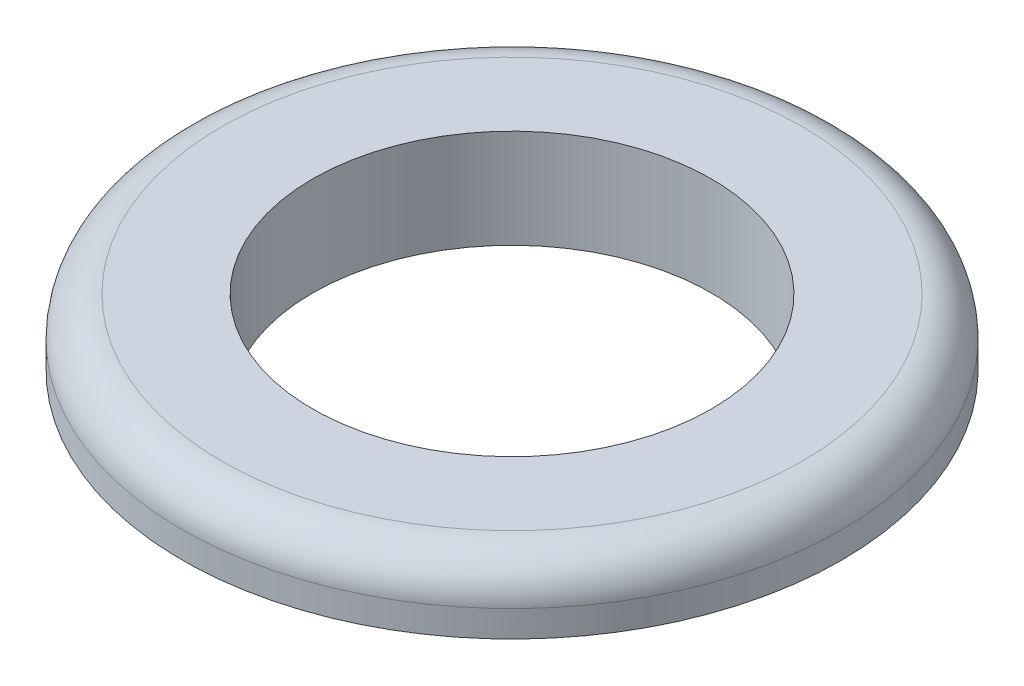
ISO-10303-21;
HEADER;
FILE_DESCRIPTION(('STEP AP214'),'2;1');
FILE_NAME('part.step','',(''),(''),'','','');
FILE_SCHEMA(('AUTOMOTIVE_DESIGN { 1 0 10303 214 1 1 1 1 }'));
ENDSEC;
DATA;
#1=APPLICATION_CONTEXT('core data for automotive mechanical design processes');
#2=APPLICATION_PROTOCOL_DEFINITION('international standard','automotive_design',2000,#1);
#3=PRODUCT_CONTEXT('',#1,'mechanical');
#4=PRODUCT('Part','Part','',(#3));
#5=PRODUCT_RELATED_PRODUCT_CATEGORY('part','',(#4));
#6=PRODUCT_DEFINITION_FORMATION('','',#4);
#7=PRODUCT_DEFINITION_CONTEXT('part definition',#1,'design');
#8=PRODUCT_DEFINITION('design','',#6,#7);
#9=PRODUCT_DEFINITION_SHAPE('','',#8);
#10=(LENGTH_UNIT() NAMED_UNIT(*) SI_UNIT(.MILLI.,.METRE.));
#11=(NAMED_UNIT(*) PLANE_ANGLE_UNIT() SI_UNIT($,.RADIAN.));
#12=(NAMED_UNIT(*) SI_UNIT($,.STERADIAN.) SOLID_ANGLE_UNIT());
#13=UNCERTAINTY_MEASURE_WITH_UNIT(LENGTH_MEASURE(1.E-05),#10,'distance_accuracy_value','');
#14=(GEOMETRIC_REPRESENTATION_CONTEXT(3) GLOBAL_UNCERTAINTY_ASSIGNED_CONTEXT((#13)) GLOBAL_UNIT_ASSIGNED_CONTEXT((#10,
#11,#12)) REPRESENTATION_CONTEXT('',''));
#15=CARTESIAN_POINT('',(0.,0.,0.));
#16=DIRECTION('',(0.,0.,1.));
#17=DIRECTION('',(1.,0.,0.));
#18=AXIS2_PLACEMENT_3D('',#15,#16,#17);
#19=CARTESIAN_POINT('',(47.,-151.,-12.));
#20=DIRECTION('',(0.,1.,0.));
#21=DIRECTION('',(1.,0.,0.));
#22=AXIS2_PLACEMENT_3D('',#19,#20,#21);
#23=PLANE('',#22);
#24=CARTESIAN_POINT('',(47.,-151.,-12.));
#25=DIRECTION('',(0.,1.,0.));
#26=DIRECTION('',(1.,0.,0.));
#27=AXIS2_PLACEMENT_3D('',#24,#25,#26);
#28=CIRCLE('',#27,7.45);
#29=CARTESIAN_POINT('',(39.55,-151.,-12.));
#30=VERTEX_POINT('',#29);
#31=EDGE_CURVE('E103',#30,#30,#28,.T.);
#32=ORIENTED_EDGE('',*,*,#31,.T.);
#33=EDGE_LOOP('',(#32));
#34=FACE_BOUND('',#33,.T.);
#35=CARTESIAN_POINT('',(47.,-151.,-12.));
#36=DIRECTION('',(0.,1.,0.));
#37=DIRECTION('',(-1.,0.,0.));
#38=AXIS2_PLACEMENT_3D('',#35,#36,#37);
#39=CIRCLE('',#38,10.);
#40=CARTESIAN_POINT('',(57.,-151.,-12.));
#41=VERTEX_POINT('',#40);
#42=EDGE_CURVE('E116',#41,#41,#39,.T.);
#43=ORIENTED_EDGE('',*,*,#42,.F.);
#44=EDGE_LOOP('',(#43));
#45=FACE_BOUND('',#44,.T.);
#46=ADVANCED_FACE('F17',(#34,#45),#23,.F.);
#47=CARTESIAN_POINT('',(47.,-151.,-12.));
#48=DIRECTION('',(0.,1.,0.));
#49=DIRECTION('',(-1.,0.,0.));
#50=AXIS2_PLACEMENT_3D('',#47,#48,#49);
#51=CYLINDRICAL_SURFACE('',#50,6.05);
#52=CARTESIAN_POINT('',(47.,-149.,-12.));
#53=DIRECTION('',(0.,-1.,0.));
#54=DIRECTION('',(-1.,0.,0.));
#55=AXIS2_PLACEMENT_3D('',#52,#53,#54);
#56=CIRCLE('',#55,6.05);
#57=CARTESIAN_POINT('',(53.05,-149.,-12.));
#58=VERTEX_POINT('',#57);
#59=EDGE_CURVE('E28',#58,#58,#56,.T.);
#60=ORIENTED_EDGE('',*,*,#59,.F.);
#61=DIRECTION('',(0.,-1.,0.));
#62=VECTOR('',#61,1.);
#63=CARTESIAN_POINT('',(53.05,-151.,-12.));
#64=LINE('',#63,#62);
#65=CARTESIAN_POINT('',(53.05,-152.,-12.));
#66=VERTEX_POINT('',#65);
#67=EDGE_CURVE('E11',#58,#66,#64,.T.);
#68=ORIENTED_EDGE('',*,*,#67,.T.);
#69=CARTESIAN_POINT('',(47.,-152.,-12.));
#70=DIRECTION('',(0.,1.,0.));
#71=DIRECTION('',(1.,0.,0.));
#72=AXIS2_PLACEMENT_3D('',#69,#70,#71);
#73=CIRCLE('',#72,6.05);
#74=CARTESIAN_POINT('',(40.95,-152.,-12.));
#75=VERTEX_POINT('',#74);
#76=EDGE_CURVE('E97',#75,#66,#73,.T.);
#77=ORIENTED_EDGE('',*,*,#76,.F.);
#78=CARTESIAN_POINT('',(47.,-152.,-12.));
#79=DIRECTION('',(0.,1.,0.));
#80=DIRECTION('',(1.,0.,0.));
#81=AXIS2_PLACEMENT_3D('',#78,#79,#80);
#82=CIRCLE('',#81,6.05);
#83=EDGE_CURVE('E94',#66,#75,#82,.T.);
#84=ORIENTED_EDGE('',*,*,#83,.F.);
#85=ORIENTED_EDGE('',*,*,#67,.F.);
#86=EDGE_LOOP('',(#60,#68,#77,#84,#85));
#87=FACE_BOUND('',#86,.T.);
#88=ADVANCED_FACE('F101',(#87),#51,.F.);
#89=CARTESIAN_POINT('',(47.,-149.,-12.));
#90=DIRECTION('',(0.,1.,0.));
#91=DIRECTION('',(1.,0.,0.));
#92=AXIS2_PLACEMENT_3D('',#89,#90,#91);
#93=PLANE('',#92);
#94=ORIENTED_EDGE('',*,*,#59,.T.);
#95=EDGE_LOOP('',(#94));
#96=FACE_BOUND('',#95,.T.);
#97=CARTESIAN_POINT('',(47.,-149.,-12.));
#98=DIRECTION('',(0.,-1.,0.));
#99=DIRECTION('',(-1.,0.,0.));
#100=AXIS2_PLACEMENT_3D('',#97,#98,#99);
#101=CIRCLE('',#100,8.8);
#102=CARTESIAN_POINT('',(55.8,-149.,-12.));
#103=VERTEX_POINT('',#102);
#104=CARTESIAN_POINT('',(47.,-149.,-20.8));
#105=VERTEX_POINT('',#104);
#106=EDGE_CURVE('E99',#103,#105,#101,.T.);
#107=ORIENTED_EDGE('',*,*,#106,.F.);
#108=CARTESIAN_POINT('',(47.,-149.,-12.));
#109=DIRECTION('',(0.,-1.,0.));
#110=DIRECTION('',(-1.,0.,0.));
#111=AXIS2_PLACEMENT_3D('',#108,#109,#110);
#112=CIRCLE('',#111,8.8);
#113=EDGE_CURVE('E141',#105,#103,#112,.T.);
#114=ORIENTED_EDGE('',*,*,#113,.F.);
#115=EDGE_LOOP('',(#107,#114));
#116=FACE_BOUND('',#115,.T.);
#117=ADVANCED_FACE('F19',(#96,#116),#93,.T.);
#118=CARTESIAN_POINT('',(47.,-151.,-12.));
#119=DIRECTION('',(0.,1.,0.));
#120=DIRECTION('',(-1.,0.,0.));
#121=AXIS2_PLACEMENT_3D('',#118,#119,#120);
#122=CYLINDRICAL_SURFACE('',#121,10.);
#123=CARTESIAN_POINT('',(47.,-150.2,-12.));
#124=DIRECTION('',(0.,1.,0.));
#125=DIRECTION('',(-1.,0.,0.));
#126=AXIS2_PLACEMENT_3D('',#123,#124,#125);
#127=CIRCLE('',#126,10.);
#128=CARTESIAN_POINT('',(57.,-150.2,-12.));
#129=VERTEX_POINT('',#128);
#130=CARTESIAN_POINT('',(47.,-150.2,-22.));
#131=VERTEX_POINT('',#130);
#132=EDGE_CURVE('E147',#129,#131,#127,.T.);
#133=ORIENTED_EDGE('',*,*,#132,.F.);
#134=DIRECTION('',(0.,-1.,0.));
#135=VECTOR('',#134,1.);
#136=CARTESIAN_POINT('',(57.,-151.,-12.));
#137=LINE('',#136,#135);
#138=EDGE_CURVE('E119',#129,#41,#137,.T.);
#139=ORIENTED_EDGE('',*,*,#138,.T.);
#140=ORIENTED_EDGE('',*,*,#42,.T.);
#141=ORIENTED_EDGE('',*,*,#138,.F.);
#142=CARTESIAN_POINT('',(47.,-150.2,-12.));
#143=DIRECTION('',(0.,1.,0.));
#144=DIRECTION('',(-1.,0.,0.));
#145=AXIS2_PLACEMENT_3D('',#142,#143,#144);
#146=CIRCLE('',#145,10.);
#147=EDGE_CURVE('E156',#131,#129,#146,.T.);
#148=ORIENTED_EDGE('',*,*,#147,.F.);
#149=EDGE_LOOP('',(#133,#139,#140,#141,#148));
#150=FACE_BOUND('',#149,.T.);
#151=ADVANCED_FACE('F175',(#150),#122,.T.);
#152=CARTESIAN_POINT('',(47.,-150.2,-12.));
#153=DIRECTION('',(0.,1.,0.));
#154=DIRECTION('',(0.,0.,1.));
#155=AXIS2_PLACEMENT_3D('',#152,#153,#154);
#156=TOROIDAL_SURFACE('',#155,8.8,1.2);
#157=ORIENTED_EDGE('',*,*,#106,.T.);
#158=CARTESIAN_POINT('',(47.,-150.2,-20.8));
#159=DIRECTION('',(-1.,0.,0.));
#160=DIRECTION('',(0.,0.,-1.));
#161=AXIS2_PLACEMENT_3D('',#158,#159,#160);
#162=CIRCLE('',#161,1.2);
#163=EDGE_CURVE('E115',#105,#131,#162,.T.);
#164=ORIENTED_EDGE('',*,*,#163,.T.);
#165=ORIENTED_EDGE('',*,*,#147,.T.);
#166=ORIENTED_EDGE('',*,*,#132,.T.);
#167=ORIENTED_EDGE('',*,*,#163,.F.);
#168=ORIENTED_EDGE('',*,*,#113,.T.);
#169=EDGE_LOOP('',(#157,#164,#165,#166,#167,#168));
#170=FACE_BOUND('',#169,.T.);
#171=ADVANCED_FACE('F170',(#170),#156,.T.);
#172=CARTESIAN_POINT('',(47.,-152.,-12.));
#173=DIRECTION('',(0.,-1.,0.));
#174=DIRECTION('',(0.,0.,-1.));
#175=AXIS2_PLACEMENT_3D('',#172,#173,#174);
#176=PLANE('',#175);
#177=ORIENTED_EDGE('',*,*,#76,.T.);
#178=ORIENTED_EDGE('',*,*,#83,.T.);
#179=EDGE_LOOP('',(#177,#178));
#180=FACE_BOUND('',#179,.T.);
#181=CARTESIAN_POINT('',(47.,-152.,-12.));
#182=DIRECTION('',(0.,1.,0.));
#183=DIRECTION('',(1.,0.,0.));
#184=AXIS2_PLACEMENT_3D('',#181,#182,#183);
#185=CIRCLE('',#184,6.95);
#186=CARTESIAN_POINT('',(40.05,-152.,-12.));
#187=VERTEX_POINT('',#186);
#188=CARTESIAN_POINT('',(47.,-152.,-5.05));
#189=VERTEX_POINT('',#188);
#190=EDGE_CURVE('E137',#187,#189,#185,.T.);
#191=ORIENTED_EDGE('',*,*,#190,.F.);
#192=CARTESIAN_POINT('',(47.,-152.,-12.));
#193=DIRECTION('',(0.,1.,0.));
#194=DIRECTION('',(1.,0.,0.));
#195=AXIS2_PLACEMENT_3D('',#192,#193,#194);
#196=CIRCLE('',#195,6.95);
#197=EDGE_CURVE('E79',#189,#187,#196,.T.);
#198=ORIENTED_EDGE('',*,*,#197,.F.);
#199=EDGE_LOOP('',(#191,#198));
#200=FACE_BOUND('',#199,.T.);
#201=ADVANCED_FACE('F96',(#180,#200),#176,.T.);
#202=CARTESIAN_POINT('',(47.,-151.,-12.));
#203=DIRECTION('',(0.,-1.,0.));
#204=DIRECTION('',(1.,0.,0.));
#205=AXIS2_PLACEMENT_3D('',#202,#203,#204);
#206=CYLINDRICAL_SURFACE('',#205,7.45);
#207=CARTESIAN_POINT('',(47.,-151.5,-12.));
#208=DIRECTION('',(0.,-1.,0.));
#209=DIRECTION('',(1.,0.,0.));
#210=AXIS2_PLACEMENT_3D('',#207,#208,#209);
#211=CIRCLE('',#210,7.45);
#212=CARTESIAN_POINT('',(39.55,-151.5,-12.));
#213=VERTEX_POINT('',#212);
#214=CARTESIAN_POINT('',(47.,-151.5,-4.55));
#215=VERTEX_POINT('',#214);
#216=EDGE_CURVE('E121',#213,#215,#211,.T.);
#217=ORIENTED_EDGE('',*,*,#216,.F.);
#218=DIRECTION('',(0.,1.,0.));
#219=VECTOR('',#218,1.);
#220=CARTESIAN_POINT('',(39.55,-151.,-12.));
#221=LINE('',#220,#219);
#222=EDGE_CURVE('E109',#213,#30,#221,.T.);
#223=ORIENTED_EDGE('',*,*,#222,.T.);
#224=ORIENTED_EDGE('',*,*,#31,.F.);
#225=ORIENTED_EDGE('',*,*,#222,.F.);
#226=CARTESIAN_POINT('',(47.,-151.5,-12.));
#227=DIRECTION('',(0.,-1.,0.));
#228=DIRECTION('',(1.,0.,0.));
#229=AXIS2_PLACEMENT_3D('',#226,#227,#228);
#230=CIRCLE('',#229,7.45);
#231=EDGE_CURVE('E21',#215,#213,#230,.T.);
#232=ORIENTED_EDGE('',*,*,#231,.F.);
#233=EDGE_LOOP('',(#217,#223,#224,#225,#232));
#234=FACE_BOUND('',#233,.T.);
#235=ADVANCED_FACE('F193',(#234),#206,.T.);
#236=CARTESIAN_POINT('',(47.,-151.5,-12.));
#237=DIRECTION('',(0.,-1.,0.));
#238=DIRECTION('',(0.,0.,-1.));
#239=AXIS2_PLACEMENT_3D('',#236,#237,#238);
#240=TOROIDAL_SURFACE('',#239,6.95,0.5);
#241=ORIENTED_EDGE('',*,*,#190,.T.);
#242=CARTESIAN_POINT('',(47.,-151.5,-5.05));
#243=DIRECTION('',(-1.,0.,0.));
#244=DIRECTION('',(0.,0.,1.));
#245=AXIS2_PLACEMENT_3D('',#242,#243,#244);
#246=CIRCLE('',#245,0.5);
#247=EDGE_CURVE('E135',#189,#215,#246,.T.);
#248=ORIENTED_EDGE('',*,*,#247,.T.);
#249=ORIENTED_EDGE('',*,*,#231,.T.);
#250=ORIENTED_EDGE('',*,*,#216,.T.);
#251=ORIENTED_EDGE('',*,*,#247,.F.);
#252=ORIENTED_EDGE('',*,*,#197,.T.);
#253=EDGE_LOOP('',(#241,#248,#249,#250,#251,#252));
#254=FACE_BOUND('',#253,.T.);
#255=ADVANCED_FACE('F196',(#254),#240,.T.);
#256=CLOSED_SHELL('',(#46,#88,#117,#151,#171,#201,#235,#255));
#257=MANIFOLD_SOLID_BREP('B1',#256);
#258=ADVANCED_BREP_SHAPE_REPRESENTATION('',(#18,#257),#14);
#259=SHAPE_DEFINITION_REPRESENTATION(#9,#258);
ENDSEC;
END-ISO-10303-21;
